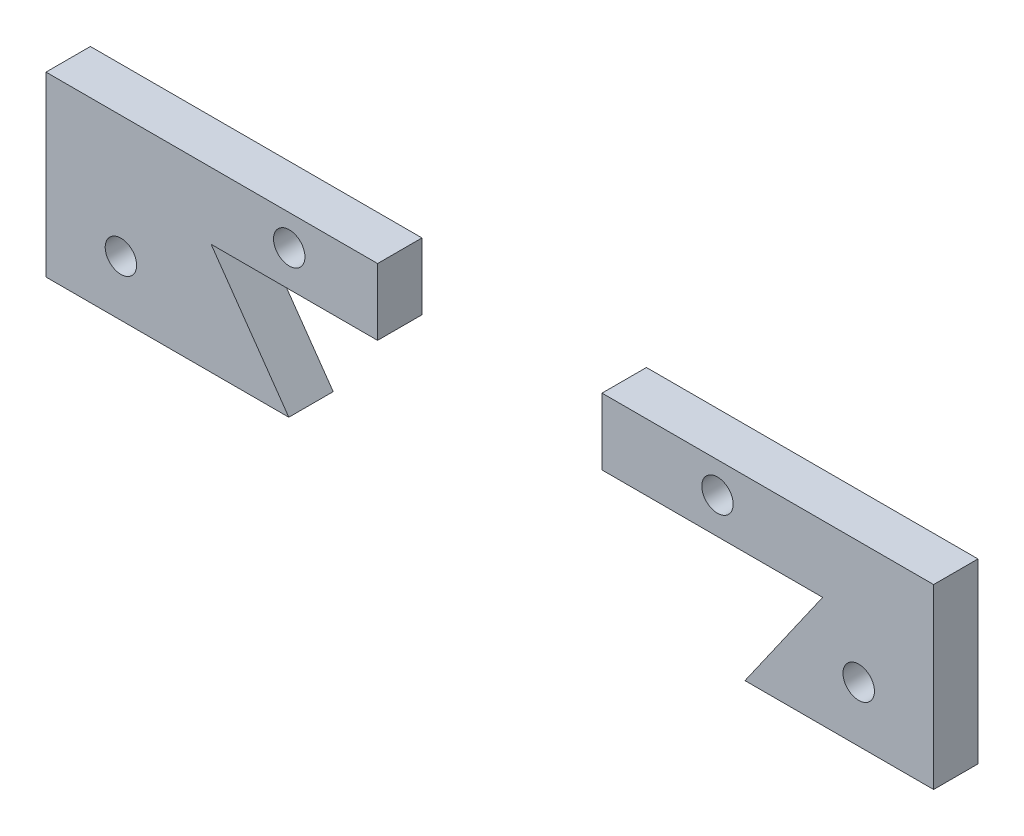
ISO-10303-21;
HEADER;
FILE_DESCRIPTION(('STEP AP214'),'2;1');
FILE_NAME('part.step','',(''),(''),'','','');
FILE_SCHEMA(('AUTOMOTIVE_DESIGN { 1 0 10303 214 1 1 1 1 }'));
ENDSEC;
DATA;
#1=APPLICATION_CONTEXT('core data for automotive mechanical design processes');
#2=APPLICATION_PROTOCOL_DEFINITION('international standard','automotive_design',2000,#1);
#3=PRODUCT_CONTEXT('',#1,'mechanical');
#4=PRODUCT('Part','Part','',(#3));
#5=PRODUCT_RELATED_PRODUCT_CATEGORY('part','',(#4));
#6=PRODUCT_DEFINITION_FORMATION('','',#4);
#7=PRODUCT_DEFINITION_CONTEXT('part definition',#1,'design');
#8=PRODUCT_DEFINITION('design','',#6,#7);
#9=PRODUCT_DEFINITION_SHAPE('','',#8);
#10=(LENGTH_UNIT() NAMED_UNIT(*) SI_UNIT(.MILLI.,.METRE.));
#11=(NAMED_UNIT(*) PLANE_ANGLE_UNIT() SI_UNIT($,.RADIAN.));
#12=(NAMED_UNIT(*) SI_UNIT($,.STERADIAN.) SOLID_ANGLE_UNIT());
#13=UNCERTAINTY_MEASURE_WITH_UNIT(LENGTH_MEASURE(1.E-05),#10,'distance_accuracy_value','');
#14=(GEOMETRIC_REPRESENTATION_CONTEXT(3) GLOBAL_UNCERTAINTY_ASSIGNED_CONTEXT((#13)) GLOBAL_UNIT_ASSIGNED_CONTEXT((#10,
#11,#12)) REPRESENTATION_CONTEXT('',''));
#15=CARTESIAN_POINT('',(0.,0.,0.));
#16=DIRECTION('',(0.,0.,1.));
#17=DIRECTION('',(1.,0.,0.));
#18=AXIS2_PLACEMENT_3D('',#15,#16,#17);
#19=CARTESIAN_POINT('',(111.125,15.875,6.35));
#20=DIRECTION('',(0.819152044288989,-0.57357643635105,0.));
#21=DIRECTION('',(0.57357643635105,0.819152044288989,0.));
#22=AXIS2_PLACEMENT_3D('',#19,#20,#21);
#23=PLANE('',#22);
#24=DIRECTION('',(-0.57357643635105,-0.819152044288989,0.));
#25=VECTOR('',#24,1.);
#26=CARTESIAN_POINT('',(111.125,15.875,0.));
#27=LINE('',#26,#25);
#28=CARTESIAN_POINT('',(111.125,15.875,0.));
#29=VERTEX_POINT('',#28);
#30=CARTESIAN_POINT('',(100.009205330921,0.,0.));
#31=VERTEX_POINT('',#30);
#32=EDGE_CURVE('E129',#29,#31,#27,.T.);
#33=ORIENTED_EDGE('',*,*,#32,.T.);
#34=DIRECTION('',(0.,0.,-1.));
#35=VECTOR('',#34,1.);
#36=CARTESIAN_POINT('',(100.009205330921,0.,6.35));
#37=LINE('',#36,#35);
#38=CARTESIAN_POINT('',(100.009205330921,0.,6.35));
#39=VERTEX_POINT('',#38);
#40=EDGE_CURVE('E12',#39,#31,#37,.T.);
#41=ORIENTED_EDGE('',*,*,#40,.F.);
#42=DIRECTION('',(-0.57357643635105,-0.819152044288989,0.));
#43=VECTOR('',#42,1.);
#44=CARTESIAN_POINT('',(111.125,15.875,6.35));
#45=LINE('',#44,#43);
#46=CARTESIAN_POINT('',(111.125,15.875,6.35));
#47=VERTEX_POINT('',#46);
#48=EDGE_CURVE('E140',#47,#39,#45,.T.);
#49=ORIENTED_EDGE('',*,*,#48,.F.);
#50=DIRECTION('',(0.,0.,-1.));
#51=VECTOR('',#50,1.);
#52=CARTESIAN_POINT('',(111.125,15.875,6.35));
#53=LINE('',#52,#51);
#54=EDGE_CURVE('E125',#47,#29,#53,.T.);
#55=ORIENTED_EDGE('',*,*,#54,.T.);
#56=EDGE_LOOP('',(#33,#41,#49,#55));
#57=FACE_BOUND('',#56,.T.);
#58=ADVANCED_FACE('F45',(#57),#23,.F.);
#59=CARTESIAN_POINT('',(100.009205330921,0.,6.35));
#60=DIRECTION('',(0.,1.,0.));
#61=DIRECTION('',(-1.,0.,0.));
#62=AXIS2_PLACEMENT_3D('',#59,#60,#61);
#63=PLANE('',#62);
#64=DIRECTION('',(1.,0.,0.));
#65=VECTOR('',#64,1.);
#66=CARTESIAN_POINT('',(100.009205330921,0.,0.));
#67=LINE('',#66,#65);
#68=CARTESIAN_POINT('',(127.,0.,0.));
#69=VERTEX_POINT('',#68);
#70=EDGE_CURVE('E132',#31,#69,#67,.T.);
#71=ORIENTED_EDGE('',*,*,#70,.T.);
#72=DIRECTION('',(0.,0.,-1.));
#73=VECTOR('',#72,1.);
#74=CARTESIAN_POINT('',(127.,0.,6.35));
#75=LINE('',#74,#73);
#76=CARTESIAN_POINT('',(127.,0.,6.35));
#77=VERTEX_POINT('',#76);
#78=EDGE_CURVE('E53',#77,#69,#75,.T.);
#79=ORIENTED_EDGE('',*,*,#78,.F.);
#80=DIRECTION('',(1.,0.,0.));
#81=VECTOR('',#80,1.);
#82=CARTESIAN_POINT('',(100.009205330921,0.,6.35));
#83=LINE('',#82,#81);
#84=EDGE_CURVE('E98',#39,#77,#83,.T.);
#85=ORIENTED_EDGE('',*,*,#84,.F.);
#86=ORIENTED_EDGE('',*,*,#40,.T.);
#87=EDGE_LOOP('',(#71,#79,#85,#86));
#88=FACE_BOUND('',#87,.T.);
#89=ADVANCED_FACE('F165',(#88),#63,.F.);
#90=CARTESIAN_POINT('',(127.,0.,6.35));
#91=DIRECTION('',(-1.,0.,0.));
#92=DIRECTION('',(0.,0.,1.));
#93=AXIS2_PLACEMENT_3D('',#90,#91,#92);
#94=PLANE('',#93);
#95=DIRECTION('',(0.,1.,0.));
#96=VECTOR('',#95,1.);
#97=CARTESIAN_POINT('',(127.,0.,0.));
#98=LINE('',#97,#96);
#99=CARTESIAN_POINT('',(127.,25.4,0.));
#100=VERTEX_POINT('',#99);
#101=EDGE_CURVE('E135',#69,#100,#98,.T.);
#102=ORIENTED_EDGE('',*,*,#101,.T.);
#103=DIRECTION('',(0.,0.,-1.));
#104=VECTOR('',#103,1.);
#105=CARTESIAN_POINT('',(127.,25.4,6.35));
#106=LINE('',#105,#104);
#107=CARTESIAN_POINT('',(127.,25.4,6.35));
#108=VERTEX_POINT('',#107);
#109=EDGE_CURVE('E120',#108,#100,#106,.T.);
#110=ORIENTED_EDGE('',*,*,#109,.F.);
#111=DIRECTION('',(0.,1.,0.));
#112=VECTOR('',#111,1.);
#113=CARTESIAN_POINT('',(127.,0.,6.35));
#114=LINE('',#113,#112);
#115=EDGE_CURVE('E111',#77,#108,#114,.T.);
#116=ORIENTED_EDGE('',*,*,#115,.F.);
#117=ORIENTED_EDGE('',*,*,#78,.T.);
#118=EDGE_LOOP('',(#102,#110,#116,#117));
#119=FACE_BOUND('',#118,.T.);
#120=ADVANCED_FACE('F146',(#119),#94,.F.);
#121=CARTESIAN_POINT('',(127.,25.4,6.35));
#122=DIRECTION('',(0.,-1.,0.));
#123=DIRECTION('',(0.,0.,-1.));
#124=AXIS2_PLACEMENT_3D('',#121,#122,#123);
#125=PLANE('',#124);
#126=DIRECTION('',(-1.,0.,0.));
#127=VECTOR('',#126,1.);
#128=CARTESIAN_POINT('',(127.,25.4,0.));
#129=LINE('',#128,#127);
#130=CARTESIAN_POINT('',(79.5563363193477,25.4,0.));
#131=VERTEX_POINT('',#130);
#132=EDGE_CURVE('E119',#100,#131,#129,.T.);
#133=ORIENTED_EDGE('',*,*,#132,.T.);
#134=DIRECTION('',(0.,0.,-1.));
#135=VECTOR('',#134,1.);
#136=CARTESIAN_POINT('',(79.5563363193477,25.4,6.35));
#137=LINE('',#136,#135);
#138=CARTESIAN_POINT('',(79.5563363193477,25.4,6.35));
#139=VERTEX_POINT('',#138);
#140=EDGE_CURVE('E116',#139,#131,#137,.T.);
#141=ORIENTED_EDGE('',*,*,#140,.F.);
#142=DIRECTION('',(-1.,0.,0.));
#143=VECTOR('',#142,1.);
#144=CARTESIAN_POINT('',(127.,25.4,6.35));
#145=LINE('',#144,#143);
#146=EDGE_CURVE('E105',#108,#139,#145,.T.);
#147=ORIENTED_EDGE('',*,*,#146,.F.);
#148=ORIENTED_EDGE('',*,*,#109,.T.);
#149=EDGE_LOOP('',(#133,#141,#147,#148));
#150=FACE_BOUND('',#149,.T.);
#151=ADVANCED_FACE('F117',(#150),#125,.F.);
#152=CARTESIAN_POINT('',(79.5563363193477,25.4,6.35));
#153=DIRECTION('',(1.,0.,0.));
#154=DIRECTION('',(0.,1.,0.));
#155=AXIS2_PLACEMENT_3D('',#152,#153,#154);
#156=PLANE('',#155);
#157=DIRECTION('',(0.,-1.,0.));
#158=VECTOR('',#157,1.);
#159=CARTESIAN_POINT('',(79.5563363193477,25.4,0.));
#160=LINE('',#159,#158);
#161=CARTESIAN_POINT('',(79.5563363193475,15.8750000000001,0.));
#162=VERTEX_POINT('',#161);
#163=EDGE_CURVE('E84',#131,#162,#160,.T.);
#164=ORIENTED_EDGE('',*,*,#163,.T.);
#165=DIRECTION('',(0.,0.,-1.));
#166=VECTOR('',#165,1.);
#167=CARTESIAN_POINT('',(79.5563363193475,15.8750000000001,6.35));
#168=LINE('',#167,#166);
#169=CARTESIAN_POINT('',(79.5563363193475,15.8750000000001,6.35));
#170=VERTEX_POINT('',#169);
#171=EDGE_CURVE('E121',#170,#162,#168,.T.);
#172=ORIENTED_EDGE('',*,*,#171,.F.);
#173=DIRECTION('',(0.,-1.,0.));
#174=VECTOR('',#173,1.);
#175=CARTESIAN_POINT('',(79.5563363193477,25.4,6.35));
#176=LINE('',#175,#174);
#177=EDGE_CURVE('E109',#139,#170,#176,.T.);
#178=ORIENTED_EDGE('',*,*,#177,.F.);
#179=ORIENTED_EDGE('',*,*,#140,.T.);
#180=EDGE_LOOP('',(#164,#172,#178,#179));
#181=FACE_BOUND('',#180,.T.);
#182=ADVANCED_FACE('F123',(#181),#156,.F.);
#183=CARTESIAN_POINT('',(79.5563363193475,15.8750000000001,6.35));
#184=DIRECTION('',(0.,1.,0.));
#185=DIRECTION('',(-1.,0.,0.));
#186=AXIS2_PLACEMENT_3D('',#183,#184,#185);
#187=PLANE('',#186);
#188=DIRECTION('',(1.,0.,0.));
#189=VECTOR('',#188,1.);
#190=CARTESIAN_POINT('',(79.5563363193475,15.8750000000001,0.));
#191=LINE('',#190,#189);
#192=EDGE_CURVE('E90',#162,#29,#191,.T.);
#193=ORIENTED_EDGE('',*,*,#192,.T.);
#194=ORIENTED_EDGE('',*,*,#54,.F.);
#195=DIRECTION('',(1.,0.,0.));
#196=VECTOR('',#195,1.);
#197=CARTESIAN_POINT('',(79.5563363193475,15.8750000000001,6.35));
#198=LINE('',#197,#196);
#199=EDGE_CURVE('E61',#170,#47,#198,.T.);
#200=ORIENTED_EDGE('',*,*,#199,.F.);
#201=ORIENTED_EDGE('',*,*,#171,.T.);
#202=EDGE_LOOP('',(#193,#194,#200,#201));
#203=FACE_BOUND('',#202,.T.);
#204=ADVANCED_FACE('F153',(#203),#187,.F.);
#205=CARTESIAN_POINT('',(0.,0.,6.35));
#206=DIRECTION('',(0.,0.,1.));
#207=DIRECTION('',(1.,0.,0.));
#208=AXIS2_PLACEMENT_3D('',#205,#206,#207);
#209=PLANE('',#208);
#210=CARTESIAN_POINT('',(96.0725623500503,21.0184999999992,6.35));
#211=DIRECTION('',(0.,0.,1.));
#212=DIRECTION('',(1.,0.,0.));
#213=AXIS2_PLACEMENT_3D('',#210,#211,#212);
#214=CIRCLE('',#213,2.24789999999998);
#215=CARTESIAN_POINT('',(98.3204623500502,21.0184999999992,6.35));
#216=VERTEX_POINT('',#215);
#217=EDGE_CURVE('E231',#216,#216,#214,.T.);
#218=ORIENTED_EDGE('',*,*,#217,.F.);
#219=EDGE_LOOP('',(#218));
#220=FACE_BOUND('',#219,.T.);
#221=CARTESIAN_POINT('',(116.283551332731,7.93749999999936,6.35));
#222=DIRECTION('',(0.,0.,1.));
#223=DIRECTION('',(1.,0.,0.));
#224=AXIS2_PLACEMENT_3D('',#221,#222,#223);
#225=CIRCLE('',#224,2.24789999999998);
#226=CARTESIAN_POINT('',(118.531451332731,7.93749999999936,6.35));
#227=VERTEX_POINT('',#226);
#228=EDGE_CURVE('E233',#227,#227,#225,.T.);
#229=ORIENTED_EDGE('',*,*,#228,.F.);
#230=EDGE_LOOP('',(#229));
#231=FACE_BOUND('',#230,.T.);
#232=ORIENTED_EDGE('',*,*,#48,.T.);
#233=ORIENTED_EDGE('',*,*,#84,.T.);
#234=ORIENTED_EDGE('',*,*,#115,.T.);
#235=ORIENTED_EDGE('',*,*,#146,.T.);
#236=ORIENTED_EDGE('',*,*,#177,.T.);
#237=ORIENTED_EDGE('',*,*,#199,.T.);
#238=EDGE_LOOP('',(#232,#233,#234,#235,#236,#237));
#239=FACE_BOUND('',#238,.T.);
#240=ADVANCED_FACE('F107',(#220,#231,#239),#209,.T.);
#241=CARTESIAN_POINT('',(0.,0.,0.));
#242=DIRECTION('',(0.,0.,1.));
#243=DIRECTION('',(1.,0.,0.));
#244=AXIS2_PLACEMENT_3D('',#241,#242,#243);
#245=PLANE('',#244);
#246=CARTESIAN_POINT('',(96.0725623500503,21.0184999999992,0.));
#247=DIRECTION('',(0.,0.,1.));
#248=DIRECTION('',(1.,0.,0.));
#249=AXIS2_PLACEMENT_3D('',#246,#247,#248);
#250=CIRCLE('',#249,2.24789999999998);
#251=CARTESIAN_POINT('',(98.3204623500502,21.0184999999992,0.));
#252=VERTEX_POINT('',#251);
#253=EDGE_CURVE('E228',#252,#252,#250,.T.);
#254=ORIENTED_EDGE('',*,*,#253,.T.);
#255=EDGE_LOOP('',(#254));
#256=FACE_BOUND('',#255,.T.);
#257=CARTESIAN_POINT('',(116.283551332731,7.93749999999936,0.));
#258=DIRECTION('',(0.,0.,1.));
#259=DIRECTION('',(1.,0.,0.));
#260=AXIS2_PLACEMENT_3D('',#257,#258,#259);
#261=CIRCLE('',#260,2.24789999999998);
#262=CARTESIAN_POINT('',(118.531451332731,7.93749999999936,0.));
#263=VERTEX_POINT('',#262);
#264=EDGE_CURVE('E133',#263,#263,#261,.T.);
#265=ORIENTED_EDGE('',*,*,#264,.T.);
#266=EDGE_LOOP('',(#265));
#267=FACE_BOUND('',#266,.T.);
#268=ORIENTED_EDGE('',*,*,#32,.F.);
#269=ORIENTED_EDGE('',*,*,#192,.F.);
#270=ORIENTED_EDGE('',*,*,#163,.F.);
#271=ORIENTED_EDGE('',*,*,#132,.F.);
#272=ORIENTED_EDGE('',*,*,#101,.F.);
#273=ORIENTED_EDGE('',*,*,#70,.F.);
#274=EDGE_LOOP('',(#268,#269,#270,#271,#272,#273));
#275=FACE_BOUND('',#274,.T.);
#276=ADVANCED_FACE('F149',(#256,#267,#275),#245,.F.);
#277=CARTESIAN_POINT('',(116.283551332731,7.93749999999936,6.34999999999999));
#278=DIRECTION('',(0.,0.,1.));
#279=DIRECTION('',(1.,0.,0.));
#280=AXIS2_PLACEMENT_3D('',#277,#278,#279);
#281=CYLINDRICAL_SURFACE('',#280,2.24789999999998);
#282=ORIENTED_EDGE('',*,*,#264,.F.);
#283=EDGE_LOOP('',(#282));
#284=FACE_BOUND('',#283,.T.);
#285=ORIENTED_EDGE('',*,*,#228,.T.);
#286=EDGE_LOOP('',(#285));
#287=FACE_BOUND('',#286,.T.);
#288=ADVANCED_FACE('F202',(#284,#287),#281,.F.);
#289=CARTESIAN_POINT('',(96.0725623500503,21.0184999999992,6.34999999999999));
#290=DIRECTION('',(0.,0.,1.));
#291=DIRECTION('',(1.,0.,0.));
#292=AXIS2_PLACEMENT_3D('',#289,#290,#291);
#293=CYLINDRICAL_SURFACE('',#292,2.24789999999998);
#294=ORIENTED_EDGE('',*,*,#253,.F.);
#295=EDGE_LOOP('',(#294));
#296=FACE_BOUND('',#295,.T.);
#297=ORIENTED_EDGE('',*,*,#217,.T.);
#298=EDGE_LOOP('',(#297));
#299=FACE_BOUND('',#298,.T.);
#300=ADVANCED_FACE('F211',(#296,#299),#293,.F.);
#301=CLOSED_SHELL('',(#58,#89,#120,#151,#182,#204,#240,#276,#288,#300));
#302=MANIFOLD_SOLID_BREP('B2',#301);
#303=CARTESIAN_POINT('',(0.,0.,6.35));
#304=DIRECTION('',(0.,1.,0.));
#305=DIRECTION('',(-1.,0.,0.));
#306=AXIS2_PLACEMENT_3D('',#303,#304,#305);
#307=PLANE('',#306);
#308=DIRECTION('',(1.,0.,0.));
#309=VECTOR('',#308,1.);
#310=CARTESIAN_POINT('',(0.,0.,0.));
#311=LINE('',#310,#309);
#312=CARTESIAN_POINT('',(0.,0.,0.));
#313=VERTEX_POINT('',#312);
#314=CARTESIAN_POINT('',(34.7427133077145,0.,0.));
#315=VERTEX_POINT('',#314);
#316=EDGE_CURVE('E347',#313,#315,#311,.T.);
#317=ORIENTED_EDGE('',*,*,#316,.T.);
#318=DIRECTION('',(0.,0.,-1.));
#319=VECTOR('',#318,1.);
#320=CARTESIAN_POINT('',(34.7427133077145,0.,6.35));
#321=LINE('',#320,#319);
#322=CARTESIAN_POINT('',(34.7427133077145,0.,6.35));
#323=VERTEX_POINT('',#322);
#324=EDGE_CURVE('E43',#323,#315,#321,.T.);
#325=ORIENTED_EDGE('',*,*,#324,.F.);
#326=DIRECTION('',(1.,0.,0.));
#327=VECTOR('',#326,1.);
#328=CARTESIAN_POINT('',(0.,0.,6.35));
#329=LINE('',#328,#327);
#330=CARTESIAN_POINT('',(0.,0.,6.35));
#331=VERTEX_POINT('',#330);
#332=EDGE_CURVE('E358',#331,#323,#329,.T.);
#333=ORIENTED_EDGE('',*,*,#332,.F.);
#334=DIRECTION('',(0.,0.,-1.));
#335=VECTOR('',#334,1.);
#336=CARTESIAN_POINT('',(0.,0.,6.35));
#337=LINE('',#336,#335);
#338=EDGE_CURVE('E343',#331,#313,#337,.T.);
#339=ORIENTED_EDGE('',*,*,#338,.T.);
#340=EDGE_LOOP('',(#317,#325,#333,#339));
#341=FACE_BOUND('',#340,.T.);
#342=ADVANCED_FACE('F263',(#341),#307,.F.);
#343=CARTESIAN_POINT('',(34.7427133077145,0.,6.35));
#344=DIRECTION('',(-0.819152044288989,-0.57357643635105,0.));
#345=DIRECTION('',(0.57357643635105,-0.819152044288989,0.));
#346=AXIS2_PLACEMENT_3D('',#343,#344,#345);
#347=PLANE('',#346);
#348=DIRECTION('',(-0.57357643635105,0.819152044288989,0.));
#349=VECTOR('',#348,1.);
#350=CARTESIAN_POINT('',(34.7427133077145,0.,0.));
#351=LINE('',#350,#349);
#352=CARTESIAN_POINT('',(23.6269186386352,15.8750000000001,0.));
#353=VERTEX_POINT('',#352);
#354=EDGE_CURVE('E350',#315,#353,#351,.T.);
#355=ORIENTED_EDGE('',*,*,#354,.T.);
#356=DIRECTION('',(0.,0.,-1.));
#357=VECTOR('',#356,1.);
#358=CARTESIAN_POINT('',(23.6269186386352,15.8750000000001,6.35));
#359=LINE('',#358,#357);
#360=CARTESIAN_POINT('',(23.6269186386352,15.8750000000001,6.35));
#361=VERTEX_POINT('',#360);
#362=EDGE_CURVE('E271',#361,#353,#359,.T.);
#363=ORIENTED_EDGE('',*,*,#362,.F.);
#364=DIRECTION('',(-0.57357643635105,0.819152044288989,0.));
#365=VECTOR('',#364,1.);
#366=CARTESIAN_POINT('',(34.7427133077145,0.,6.35));
#367=LINE('',#366,#365);
#368=EDGE_CURVE('E316',#323,#361,#367,.T.);
#369=ORIENTED_EDGE('',*,*,#368,.F.);
#370=ORIENTED_EDGE('',*,*,#324,.T.);
#371=EDGE_LOOP('',(#355,#363,#369,#370));
#372=FACE_BOUND('',#371,.T.);
#373=ADVANCED_FACE('F383',(#372),#347,.F.);
#374=CARTESIAN_POINT('',(23.6269186386352,15.8750000000001,6.35));
#375=DIRECTION('',(0.,1.,0.));
#376=DIRECTION('',(0.,0.,1.));
#377=AXIS2_PLACEMENT_3D('',#374,#375,#376);
#378=PLANE('',#377);
#379=DIRECTION('',(1.,0.,0.));
#380=VECTOR('',#379,1.);
#381=CARTESIAN_POINT('',(23.6269186386352,15.8750000000001,0.));
#382=LINE('',#381,#380);
#383=CARTESIAN_POINT('',(47.4436636806524,15.8750000000001,0.));
#384=VERTEX_POINT('',#383);
#385=EDGE_CURVE('E353',#353,#384,#382,.T.);
#386=ORIENTED_EDGE('',*,*,#385,.T.);
#387=DIRECTION('',(0.,0.,-1.));
#388=VECTOR('',#387,1.);
#389=CARTESIAN_POINT('',(47.4436636806524,15.8750000000001,6.35));
#390=LINE('',#389,#388);
#391=CARTESIAN_POINT('',(47.4436636806524,15.8750000000001,6.35));
#392=VERTEX_POINT('',#391);
#393=EDGE_CURVE('E338',#392,#384,#390,.T.);
#394=ORIENTED_EDGE('',*,*,#393,.F.);
#395=DIRECTION('',(1.,0.,0.));
#396=VECTOR('',#395,1.);
#397=CARTESIAN_POINT('',(23.6269186386352,15.8750000000001,6.35));
#398=LINE('',#397,#396);
#399=EDGE_CURVE('E329',#361,#392,#398,.T.);
#400=ORIENTED_EDGE('',*,*,#399,.F.);
#401=ORIENTED_EDGE('',*,*,#362,.T.);
#402=EDGE_LOOP('',(#386,#394,#400,#401));
#403=FACE_BOUND('',#402,.T.);
#404=ADVANCED_FACE('F364',(#403),#378,.F.);
#405=CARTESIAN_POINT('',(47.4436636806521,25.4,6.35));
#406=DIRECTION('',(-1.,0.,0.));
#407=DIRECTION('',(0.,-1.,0.));
#408=AXIS2_PLACEMENT_3D('',#405,#406,#407);
#409=PLANE('',#408);
#410=DIRECTION('',(0.,1.,0.));
#411=VECTOR('',#410,1.);
#412=CARTESIAN_POINT('',(47.4436636806521,25.4,0.));
#413=LINE('',#412,#411);
#414=CARTESIAN_POINT('',(47.4436636806521,25.4,0.));
#415=VERTEX_POINT('',#414);
#416=EDGE_CURVE('E337',#384,#415,#413,.T.);
#417=ORIENTED_EDGE('',*,*,#416,.T.);
#418=DIRECTION('',(0.,0.,-1.));
#419=VECTOR('',#418,1.);
#420=CARTESIAN_POINT('',(47.4436636806521,25.4,6.35));
#421=LINE('',#420,#419);
#422=CARTESIAN_POINT('',(47.4436636806521,25.4,6.35));
#423=VERTEX_POINT('',#422);
#424=EDGE_CURVE('E334',#423,#415,#421,.T.);
#425=ORIENTED_EDGE('',*,*,#424,.F.);
#426=DIRECTION('',(0.,1.,0.));
#427=VECTOR('',#426,1.);
#428=CARTESIAN_POINT('',(47.4436636806521,25.4,6.35));
#429=LINE('',#428,#427);
#430=EDGE_CURVE('E323',#392,#423,#429,.T.);
#431=ORIENTED_EDGE('',*,*,#430,.F.);
#432=ORIENTED_EDGE('',*,*,#393,.T.);
#433=EDGE_LOOP('',(#417,#425,#431,#432));
#434=FACE_BOUND('',#433,.T.);
#435=ADVANCED_FACE('F335',(#434),#409,.F.);
#436=CARTESIAN_POINT('',(0.,25.4,6.35));
#437=DIRECTION('',(0.,-1.,0.));
#438=DIRECTION('',(0.,0.,-1.));
#439=AXIS2_PLACEMENT_3D('',#436,#437,#438);
#440=PLANE('',#439);
#441=DIRECTION('',(-1.,0.,0.));
#442=VECTOR('',#441,1.);
#443=CARTESIAN_POINT('',(0.,25.4,0.));
#444=LINE('',#443,#442);
#445=CARTESIAN_POINT('',(0.,25.4,0.));
#446=VERTEX_POINT('',#445);
#447=EDGE_CURVE('E302',#415,#446,#444,.T.);
#448=ORIENTED_EDGE('',*,*,#447,.T.);
#449=DIRECTION('',(0.,0.,-1.));
#450=VECTOR('',#449,1.);
#451=CARTESIAN_POINT('',(0.,25.4,6.35));
#452=LINE('',#451,#450);
#453=CARTESIAN_POINT('',(0.,25.4,6.35));
#454=VERTEX_POINT('',#453);
#455=EDGE_CURVE('E339',#454,#446,#452,.T.);
#456=ORIENTED_EDGE('',*,*,#455,.F.);
#457=DIRECTION('',(-1.,0.,0.));
#458=VECTOR('',#457,1.);
#459=CARTESIAN_POINT('',(0.,25.4,6.35));
#460=LINE('',#459,#458);
#461=EDGE_CURVE('E327',#423,#454,#460,.T.);
#462=ORIENTED_EDGE('',*,*,#461,.F.);
#463=ORIENTED_EDGE('',*,*,#424,.T.);
#464=EDGE_LOOP('',(#448,#456,#462,#463));
#465=FACE_BOUND('',#464,.T.);
#466=ADVANCED_FACE('F341',(#465),#440,.F.);
#467=CARTESIAN_POINT('',(0.,0.,6.35));
#468=DIRECTION('',(1.,0.,0.));
#469=DIRECTION('',(0.,0.,-1.));
#470=AXIS2_PLACEMENT_3D('',#467,#468,#469);
#471=PLANE('',#470);
#472=DIRECTION('',(0.,-1.,0.));
#473=VECTOR('',#472,1.);
#474=CARTESIAN_POINT('',(0.,0.,0.));
#475=LINE('',#474,#473);
#476=EDGE_CURVE('E308',#446,#313,#475,.T.);
#477=ORIENTED_EDGE('',*,*,#476,.T.);
#478=ORIENTED_EDGE('',*,*,#338,.F.);
#479=DIRECTION('',(0.,-1.,0.));
#480=VECTOR('',#479,1.);
#481=CARTESIAN_POINT('',(0.,0.,6.35));
#482=LINE('',#481,#480);
#483=EDGE_CURVE('E279',#454,#331,#482,.T.);
#484=ORIENTED_EDGE('',*,*,#483,.F.);
#485=ORIENTED_EDGE('',*,*,#455,.T.);
#486=EDGE_LOOP('',(#477,#478,#484,#485));
#487=FACE_BOUND('',#486,.T.);
#488=ADVANCED_FACE('F371',(#487),#471,.F.);
#489=CARTESIAN_POINT('',(0.,0.,6.35));
#490=DIRECTION('',(0.,0.,-1.));
#491=DIRECTION('',(-1.,0.,0.));
#492=AXIS2_PLACEMENT_3D('',#489,#490,#491);
#493=PLANE('',#492);
#494=CARTESIAN_POINT('',(10.7164486672701,7.93749999999935,6.35));
#495=DIRECTION('',(0.,0.,1.));
#496=DIRECTION('',(1.,0.,0.));
#497=AXIS2_PLACEMENT_3D('',#494,#495,#496);
#498=CIRCLE('',#497,2.24789999999999);
#499=CARTESIAN_POINT('',(12.96434866727,7.93749999999935,6.35));
#500=VERTEX_POINT('',#499);
#501=EDGE_CURVE('E449',#500,#500,#498,.T.);
#502=ORIENTED_EDGE('',*,*,#501,.F.);
#503=EDGE_LOOP('',(#502));
#504=FACE_BOUND('',#503,.T.);
#505=CARTESIAN_POINT('',(34.8033969692684,21.0184999999992,6.35));
#506=DIRECTION('',(0.,0.,1.));
#507=DIRECTION('',(1.,0.,0.));
#508=AXIS2_PLACEMENT_3D('',#505,#506,#507);
#509=CIRCLE('',#508,2.24789999999998);
#510=CARTESIAN_POINT('',(37.0512969692684,21.0184999999992,6.35));
#511=VERTEX_POINT('',#510);
#512=EDGE_CURVE('E451',#511,#511,#509,.T.);
#513=ORIENTED_EDGE('',*,*,#512,.F.);
#514=EDGE_LOOP('',(#513));
#515=FACE_BOUND('',#514,.T.);
#516=ORIENTED_EDGE('',*,*,#332,.T.);
#517=ORIENTED_EDGE('',*,*,#368,.T.);
#518=ORIENTED_EDGE('',*,*,#399,.T.);
#519=ORIENTED_EDGE('',*,*,#430,.T.);
#520=ORIENTED_EDGE('',*,*,#461,.T.);
#521=ORIENTED_EDGE('',*,*,#483,.T.);
#522=EDGE_LOOP('',(#516,#517,#518,#519,#520,#521));
#523=FACE_BOUND('',#522,.T.);
#524=ADVANCED_FACE('F325',(#504,#515,#523),#493,.F.);
#525=CARTESIAN_POINT('',(0.,0.,0.));
#526=DIRECTION('',(0.,0.,-1.));
#527=DIRECTION('',(-1.,0.,0.));
#528=AXIS2_PLACEMENT_3D('',#525,#526,#527);
#529=PLANE('',#528);
#530=CARTESIAN_POINT('',(10.7164486672701,7.93749999999935,0.));
#531=DIRECTION('',(0.,0.,1.));
#532=DIRECTION('',(1.,0.,0.));
#533=AXIS2_PLACEMENT_3D('',#530,#531,#532);
#534=CIRCLE('',#533,2.24789999999999);
#535=CARTESIAN_POINT('',(12.96434866727,7.93749999999935,0.));
#536=VERTEX_POINT('',#535);
#537=EDGE_CURVE('E446',#536,#536,#534,.T.);
#538=ORIENTED_EDGE('',*,*,#537,.T.);
#539=EDGE_LOOP('',(#538));
#540=FACE_BOUND('',#539,.T.);
#541=CARTESIAN_POINT('',(34.8033969692684,21.0184999999992,0.));
#542=DIRECTION('',(0.,0.,1.));
#543=DIRECTION('',(1.,0.,0.));
#544=AXIS2_PLACEMENT_3D('',#541,#542,#543);
#545=CIRCLE('',#544,2.24789999999998);
#546=CARTESIAN_POINT('',(37.0512969692684,21.0184999999992,0.));
#547=VERTEX_POINT('',#546);
#548=EDGE_CURVE('E351',#547,#547,#545,.T.);
#549=ORIENTED_EDGE('',*,*,#548,.T.);
#550=EDGE_LOOP('',(#549));
#551=FACE_BOUND('',#550,.T.);
#552=ORIENTED_EDGE('',*,*,#316,.F.);
#553=ORIENTED_EDGE('',*,*,#476,.F.);
#554=ORIENTED_EDGE('',*,*,#447,.F.);
#555=ORIENTED_EDGE('',*,*,#416,.F.);
#556=ORIENTED_EDGE('',*,*,#385,.F.);
#557=ORIENTED_EDGE('',*,*,#354,.F.);
#558=EDGE_LOOP('',(#552,#553,#554,#555,#556,#557));
#559=FACE_BOUND('',#558,.T.);
#560=ADVANCED_FACE('F367',(#540,#551,#559),#529,.T.);
#561=CARTESIAN_POINT('',(34.8033969692684,21.0184999999992,6.34999999999999));
#562=DIRECTION('',(0.,0.,1.));
#563=DIRECTION('',(1.,0.,0.));
#564=AXIS2_PLACEMENT_3D('',#561,#562,#563);
#565=CYLINDRICAL_SURFACE('',#564,2.24789999999998);
#566=ORIENTED_EDGE('',*,*,#548,.F.);
#567=EDGE_LOOP('',(#566));
#568=FACE_BOUND('',#567,.T.);
#569=ORIENTED_EDGE('',*,*,#512,.T.);
#570=EDGE_LOOP('',(#569));
#571=FACE_BOUND('',#570,.T.);
#572=ADVANCED_FACE('F420',(#568,#571),#565,.F.);
#573=CARTESIAN_POINT('',(10.7164486672701,7.93749999999935,6.34999999999999));
#574=DIRECTION('',(0.,0.,1.));
#575=DIRECTION('',(1.,0.,0.));
#576=AXIS2_PLACEMENT_3D('',#573,#574,#575);
#577=CYLINDRICAL_SURFACE('',#576,2.24789999999999);
#578=ORIENTED_EDGE('',*,*,#537,.F.);
#579=EDGE_LOOP('',(#578));
#580=FACE_BOUND('',#579,.T.);
#581=ORIENTED_EDGE('',*,*,#501,.T.);
#582=EDGE_LOOP('',(#581));
#583=FACE_BOUND('',#582,.T.);
#584=ADVANCED_FACE('F429',(#580,#583),#577,.F.);
#585=CLOSED_SHELL('',(#342,#373,#404,#435,#466,#488,#524,#560,#572,#584));
#586=MANIFOLD_SOLID_BREP('B6',#585);
#587=ADVANCED_BREP_SHAPE_REPRESENTATION('',(#18,#302,#586),#14);
#588=SHAPE_DEFINITION_REPRESENTATION(#9,#587);
ENDSEC;
END-ISO-10303-21;
